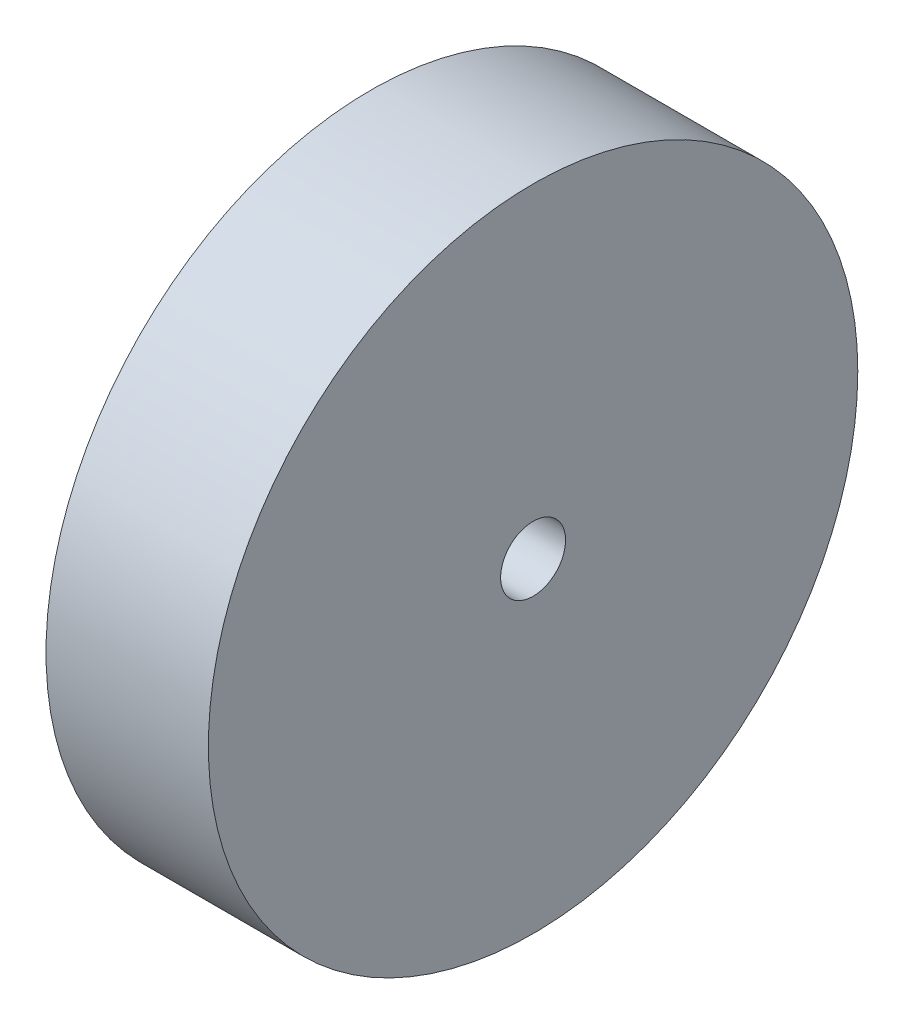
ISO-10303-21;
HEADER;
FILE_DESCRIPTION(('STEP AP214'),'2;1');
FILE_NAME('part.step','',(''),(''),'','','');
FILE_SCHEMA(('AUTOMOTIVE_DESIGN { 1 0 10303 214 1 1 1 1 }'));
ENDSEC;
DATA;
#1=APPLICATION_CONTEXT('core data for automotive mechanical design processes');
#2=APPLICATION_PROTOCOL_DEFINITION('international standard','automotive_design',2000,#1);
#3=PRODUCT_CONTEXT('',#1,'mechanical');
#4=PRODUCT('Part','Part','',(#3));
#5=PRODUCT_RELATED_PRODUCT_CATEGORY('part','',(#4));
#6=PRODUCT_DEFINITION_FORMATION('','',#4);
#7=PRODUCT_DEFINITION_CONTEXT('part definition',#1,'design');
#8=PRODUCT_DEFINITION('design','',#6,#7);
#9=PRODUCT_DEFINITION_SHAPE('','',#8);
#10=(LENGTH_UNIT() NAMED_UNIT(*) SI_UNIT(.MILLI.,.METRE.));
#11=(NAMED_UNIT(*) PLANE_ANGLE_UNIT() SI_UNIT($,.RADIAN.));
#12=(NAMED_UNIT(*) SI_UNIT($,.STERADIAN.) SOLID_ANGLE_UNIT());
#13=UNCERTAINTY_MEASURE_WITH_UNIT(LENGTH_MEASURE(1.E-05),#10,'distance_accuracy_value','');
#14=(GEOMETRIC_REPRESENTATION_CONTEXT(3) GLOBAL_UNCERTAINTY_ASSIGNED_CONTEXT((#13)) GLOBAL_UNIT_ASSIGNED_CONTEXT((#10,
#11,#12)) REPRESENTATION_CONTEXT('',''));
#15=CARTESIAN_POINT('',(0.,0.,0.));
#16=DIRECTION('',(0.,0.,1.));
#17=DIRECTION('',(1.,0.,0.));
#18=AXIS2_PLACEMENT_3D('',#15,#16,#17);
#19=CARTESIAN_POINT('',(5.,0.,0.));
#20=DIRECTION('',(1.,0.,0.));
#21=DIRECTION('',(0.,0.,-1.));
#22=AXIS2_PLACEMENT_3D('',#19,#20,#21);
#23=PLANE('',#22);
#24=CARTESIAN_POINT('',(5.,0.,0.));
#25=DIRECTION('',(1.,0.,0.));
#26=DIRECTION('',(0.,0.,-1.));
#27=AXIS2_PLACEMENT_3D('',#24,#25,#26);
#28=CIRCLE('',#27,10.);
#29=CARTESIAN_POINT('',(5.,0.,-10.));
#30=VERTEX_POINT('',#29);
#31=EDGE_CURVE('E10',#30,#30,#28,.T.);
#32=ORIENTED_EDGE('',*,*,#31,.T.);
#33=EDGE_LOOP('',(#32));
#34=FACE_BOUND('',#33,.T.);
#35=CARTESIAN_POINT('',(5.,0.,0.));
#36=DIRECTION('',(1.,0.,0.));
#37=DIRECTION('',(0.,0.,-1.));
#38=AXIS2_PLACEMENT_3D('',#35,#36,#37);
#39=CIRCLE('',#38,1.);
#40=CARTESIAN_POINT('',(5.,0.,-1.));
#41=VERTEX_POINT('',#40);
#42=EDGE_CURVE('E44',#41,#41,#39,.T.);
#43=ORIENTED_EDGE('',*,*,#42,.F.);
#44=EDGE_LOOP('',(#43));
#45=FACE_BOUND('',#44,.T.);
#46=ADVANCED_FACE('F33',(#34,#45),#23,.T.);
#47=CARTESIAN_POINT('',(0.,0.,0.));
#48=DIRECTION('',(1.,0.,0.));
#49=DIRECTION('',(0.,0.,-1.));
#50=AXIS2_PLACEMENT_3D('',#47,#48,#49);
#51=PLANE('',#50);
#52=CARTESIAN_POINT('',(0.,0.,0.));
#53=DIRECTION('',(1.,0.,0.));
#54=DIRECTION('',(0.,0.,-1.));
#55=AXIS2_PLACEMENT_3D('',#52,#53,#54);
#56=CIRCLE('',#55,10.);
#57=CARTESIAN_POINT('',(0.,0.,-10.));
#58=VERTEX_POINT('',#57);
#59=EDGE_CURVE('E37',#58,#58,#56,.T.);
#60=ORIENTED_EDGE('',*,*,#59,.F.);
#61=EDGE_LOOP('',(#60));
#62=FACE_BOUND('',#61,.T.);
#63=CARTESIAN_POINT('',(0.,0.,0.));
#64=DIRECTION('',(1.,0.,0.));
#65=DIRECTION('',(0.,0.,-1.));
#66=AXIS2_PLACEMENT_3D('',#63,#64,#65);
#67=CIRCLE('',#66,1.);
#68=CARTESIAN_POINT('',(0.,0.,-1.));
#69=VERTEX_POINT('',#68);
#70=EDGE_CURVE('E46',#69,#69,#67,.T.);
#71=ORIENTED_EDGE('',*,*,#70,.T.);
#72=EDGE_LOOP('',(#71));
#73=FACE_BOUND('',#72,.T.);
#74=ADVANCED_FACE('F56',(#62,#73),#51,.F.);
#75=CARTESIAN_POINT('',(5.,0.,0.));
#76=DIRECTION('',(-1.,0.,0.));
#77=DIRECTION('',(0.,0.,1.));
#78=AXIS2_PLACEMENT_3D('',#75,#76,#77);
#79=CYLINDRICAL_SURFACE('',#78,10.);
#80=ORIENTED_EDGE('',*,*,#31,.F.);
#81=EDGE_LOOP('',(#80));
#82=FACE_BOUND('',#81,.T.);
#83=ORIENTED_EDGE('',*,*,#59,.T.);
#84=EDGE_LOOP('',(#83));
#85=FACE_BOUND('',#84,.T.);
#86=ADVANCED_FACE('F35',(#82,#85),#79,.T.);
#87=CARTESIAN_POINT('',(5.,0.,0.));
#88=DIRECTION('',(-1.,0.,0.));
#89=DIRECTION('',(0.,0.,1.));
#90=AXIS2_PLACEMENT_3D('',#87,#88,#89);
#91=CYLINDRICAL_SURFACE('',#90,1.);
#92=ORIENTED_EDGE('',*,*,#42,.T.);
#93=EDGE_LOOP('',(#92));
#94=FACE_BOUND('',#93,.T.);
#95=ORIENTED_EDGE('',*,*,#70,.F.);
#96=EDGE_LOOP('',(#95));
#97=FACE_BOUND('',#96,.T.);
#98=ADVANCED_FACE('F52',(#94,#97),#91,.F.);
#99=CLOSED_SHELL('',(#46,#74,#86,#98));
#100=MANIFOLD_SOLID_BREP('B2',#99);
#101=ADVANCED_BREP_SHAPE_REPRESENTATION('',(#18,#100),#14);
#102=SHAPE_DEFINITION_REPRESENTATION(#9,#101);
ENDSEC;
END-ISO-10303-21;
